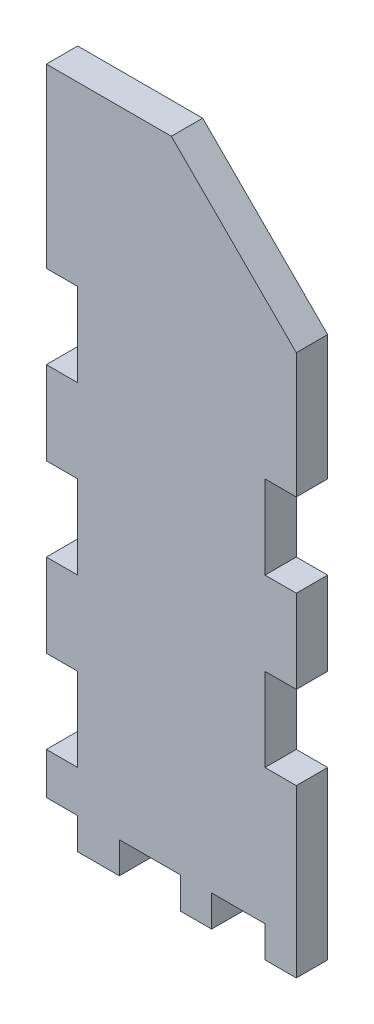
ISO-10303-21;
HEADER;
FILE_DESCRIPTION(('STEP AP214'),'2;1');
FILE_NAME('part.step','',(''),(''),'','','');
FILE_SCHEMA(('AUTOMOTIVE_DESIGN { 1 0 10303 214 1 1 1 1 }'));
ENDSEC;
DATA;
#1=APPLICATION_CONTEXT('core data for automotive mechanical design processes');
#2=APPLICATION_PROTOCOL_DEFINITION('international standard','automotive_design',2000,#1);
#3=PRODUCT_CONTEXT('',#1,'mechanical');
#4=PRODUCT('Part','Part','',(#3));
#5=PRODUCT_RELATED_PRODUCT_CATEGORY('part','',(#4));
#6=PRODUCT_DEFINITION_FORMATION('','',#4);
#7=PRODUCT_DEFINITION_CONTEXT('part definition',#1,'design');
#8=PRODUCT_DEFINITION('design','',#6,#7);
#9=PRODUCT_DEFINITION_SHAPE('','',#8);
#10=(LENGTH_UNIT() NAMED_UNIT(*) SI_UNIT(.MILLI.,.METRE.));
#11=(NAMED_UNIT(*) PLANE_ANGLE_UNIT() SI_UNIT($,.RADIAN.));
#12=(NAMED_UNIT(*) SI_UNIT($,.STERADIAN.) SOLID_ANGLE_UNIT());
#13=UNCERTAINTY_MEASURE_WITH_UNIT(LENGTH_MEASURE(1.E-05),#10,'distance_accuracy_value','');
#14=(GEOMETRIC_REPRESENTATION_CONTEXT(3) GLOBAL_UNCERTAINTY_ASSIGNED_CONTEXT((#13)) GLOBAL_UNIT_ASSIGNED_CONTEXT((#10,
#11,#12)) REPRESENTATION_CONTEXT('',''));
#15=CARTESIAN_POINT('',(0.,0.,0.));
#16=DIRECTION('',(0.,0.,1.));
#17=DIRECTION('',(1.,0.,0.));
#18=AXIS2_PLACEMENT_3D('',#15,#16,#17);
#19=CARTESIAN_POINT('',(0.,0.,4.7752));
#20=DIRECTION('',(1.,0.,0.));
#21=DIRECTION('',(0.,0.,-1.));
#22=AXIS2_PLACEMENT_3D('',#19,#20,#21);
#23=PLANE('',#22);
#24=DIRECTION('',(0.,0.,1.));
#25=VECTOR('',#24,1.);
#26=CARTESIAN_POINT('',(0.,36.5252,-1.5748));
#27=LINE('',#26,#25);
#28=CARTESIAN_POINT('',(0.,36.5252,0.));
#29=VERTEX_POINT('',#28);
#30=CARTESIAN_POINT('',(0.,36.5252,4.7752));
#31=VERTEX_POINT('',#30);
#32=EDGE_CURVE('E354',#29,#31,#27,.T.);
#33=ORIENTED_EDGE('',*,*,#32,.F.);
#34=DIRECTION('',(0.,-1.,0.));
#35=VECTOR('',#34,1.);
#36=CARTESIAN_POINT('',(0.,0.,0.));
#37=LINE('',#36,#35);
#38=CARTESIAN_POINT('',(0.,23.8252,0.));
#39=VERTEX_POINT('',#38);
#40=EDGE_CURVE('E623',#29,#39,#37,.T.);
#41=ORIENTED_EDGE('',*,*,#40,.T.);
#42=DIRECTION('',(0.,0.,1.));
#43=VECTOR('',#42,1.);
#44=CARTESIAN_POINT('',(0.,23.8252,-1.5748));
#45=LINE('',#44,#43);
#46=CARTESIAN_POINT('',(0.,23.8252,4.7752));
#47=VERTEX_POINT('',#46);
#48=EDGE_CURVE('E308',#39,#47,#45,.T.);
#49=ORIENTED_EDGE('',*,*,#48,.T.);
#50=DIRECTION('',(0.,-1.,0.));
#51=VECTOR('',#50,1.);
#52=CARTESIAN_POINT('',(0.,0.,4.7752));
#53=LINE('',#52,#51);
#54=EDGE_CURVE('E629',#31,#47,#53,.T.);
#55=ORIENTED_EDGE('',*,*,#54,.F.);
#56=EDGE_LOOP('',(#33,#41,#49,#55));
#57=FACE_BOUND('',#56,.T.);
#58=ADVANCED_FACE('F45',(#57),#23,.F.);
#59=DIRECTION('',(0.,0.,1.));
#60=VECTOR('',#59,1.);
#61=CARTESIAN_POINT('',(0.,11.1252,-1.5748));
#62=LINE('',#61,#60);
#63=CARTESIAN_POINT('',(0.,11.1252,0.));
#64=VERTEX_POINT('',#63);
#65=CARTESIAN_POINT('',(0.,11.1252,4.7752));
#66=VERTEX_POINT('',#65);
#67=EDGE_CURVE('E313',#64,#66,#62,.T.);
#68=ORIENTED_EDGE('',*,*,#67,.F.);
#69=CARTESIAN_POINT('',(0.,4.7752,0.));
#70=VERTEX_POINT('',#69);
#71=EDGE_CURVE('E419',#64,#70,#37,.T.);
#72=ORIENTED_EDGE('',*,*,#71,.T.);
#73=DIRECTION('',(0.,0.,1.));
#74=VECTOR('',#73,1.);
#75=CARTESIAN_POINT('',(0.,4.7752,-1.5748));
#76=LINE('',#75,#74);
#77=CARTESIAN_POINT('',(0.,4.7752,4.7752));
#78=VERTEX_POINT('',#77);
#79=EDGE_CURVE('E415',#70,#78,#76,.T.);
#80=ORIENTED_EDGE('',*,*,#79,.T.);
#81=EDGE_CURVE('E480',#66,#78,#53,.T.);
#82=ORIENTED_EDGE('',*,*,#81,.F.);
#83=EDGE_LOOP('',(#68,#72,#80,#82));
#84=FACE_BOUND('',#83,.T.);
#85=ADVANCED_FACE('F645',(#84),#23,.F.);
#86=DIRECTION('',(0.,0.,1.));
#87=VECTOR('',#86,1.);
#88=CARTESIAN_POINT('',(0.,74.6252,-1.5748));
#89=LINE('',#88,#87);
#90=CARTESIAN_POINT('',(0.,74.6252,0.));
#91=VERTEX_POINT('',#90);
#92=CARTESIAN_POINT('',(0.,74.6252,4.7752));
#93=VERTEX_POINT('',#92);
#94=EDGE_CURVE('E379',#91,#93,#89,.T.);
#95=ORIENTED_EDGE('',*,*,#94,.T.);
#96=CARTESIAN_POINT('',(0.,101.6,4.7752));
#97=VERTEX_POINT('',#96);
#98=EDGE_CURVE('E474',#97,#93,#53,.T.);
#99=ORIENTED_EDGE('',*,*,#98,.F.);
#100=DIRECTION('',(0.,0.,-1.));
#101=VECTOR('',#100,1.);
#102=CARTESIAN_POINT('',(0.,101.6,4.7752));
#103=LINE('',#102,#101);
#104=CARTESIAN_POINT('',(0.,101.6,0.));
#105=VERTEX_POINT('',#104);
#106=EDGE_CURVE('E495',#97,#105,#103,.T.);
#107=ORIENTED_EDGE('',*,*,#106,.T.);
#108=EDGE_CURVE('E496',#105,#91,#37,.T.);
#109=ORIENTED_EDGE('',*,*,#108,.T.);
#110=EDGE_LOOP('',(#95,#99,#107,#109));
#111=FACE_BOUND('',#110,.T.);
#112=ADVANCED_FACE('F667',(#111),#23,.F.);
#113=CARTESIAN_POINT('',(0.,0.,4.7752));
#114=DIRECTION('',(0.,0.,-1.));
#115=DIRECTION('',(-1.,0.,0.));
#116=AXIS2_PLACEMENT_3D('',#113,#114,#115);
#117=PLANE('',#116);
#118=DIRECTION('',(-1.,0.,0.));
#119=VECTOR('',#118,1.);
#120=CARTESIAN_POINT('',(38.1,50.8,4.7752));
#121=LINE('',#120,#119);
#122=CARTESIAN_POINT('',(38.1,50.8,4.7752));
#123=VERTEX_POINT('',#122);
#124=CARTESIAN_POINT('',(33.3248,50.8,4.7752));
#125=VERTEX_POINT('',#124);
#126=EDGE_CURVE('E345',#123,#125,#121,.T.);
#127=ORIENTED_EDGE('',*,*,#126,.T.);
#128=DIRECTION('',(0.,-1.,0.));
#129=VECTOR('',#128,1.);
#130=CARTESIAN_POINT('',(33.3248,63.5,4.7752));
#131=LINE('',#130,#129);
#132=CARTESIAN_POINT('',(33.3248,63.5,4.7752));
#133=VERTEX_POINT('',#132);
#134=EDGE_CURVE('E341',#133,#125,#131,.T.);
#135=ORIENTED_EDGE('',*,*,#134,.F.);
#136=DIRECTION('',(-1.,0.,0.));
#137=VECTOR('',#136,1.);
#138=CARTESIAN_POINT('',(38.1,63.5,4.7752));
#139=LINE('',#138,#137);
#140=CARTESIAN_POINT('',(38.1,63.5,4.7752));
#141=VERTEX_POINT('',#140);
#142=EDGE_CURVE('E337',#141,#133,#139,.T.);
#143=ORIENTED_EDGE('',*,*,#142,.F.);
#144=DIRECTION('',(0.,1.,0.));
#145=VECTOR('',#144,1.);
#146=CARTESIAN_POINT('',(38.1,82.55,4.7752));
#147=LINE('',#146,#145);
#148=CARTESIAN_POINT('',(38.1,82.55,4.7752));
#149=VERTEX_POINT('',#148);
#150=EDGE_CURVE('E489',#141,#149,#147,.T.);
#151=ORIENTED_EDGE('',*,*,#150,.T.);
#152=DIRECTION('',(-0.707106781186548,0.707106781186548,0.));
#153=VECTOR('',#152,1.);
#154=CARTESIAN_POINT('',(19.05,101.6,4.7752));
#155=LINE('',#154,#153);
#156=CARTESIAN_POINT('',(19.05,101.6,4.7752));
#157=VERTEX_POINT('',#156);
#158=EDGE_CURVE('E487',#149,#157,#155,.T.);
#159=ORIENTED_EDGE('',*,*,#158,.T.);
#160=DIRECTION('',(-1.,0.,0.));
#161=VECTOR('',#160,1.);
#162=CARTESIAN_POINT('',(0.,101.6,4.7752));
#163=LINE('',#162,#161);
#164=EDGE_CURVE('E492',#157,#97,#163,.T.);
#165=ORIENTED_EDGE('',*,*,#164,.T.);
#166=ORIENTED_EDGE('',*,*,#98,.T.);
#167=DIRECTION('',(1.,0.,0.));
#168=VECTOR('',#167,1.);
#169=CARTESIAN_POINT('',(0.,74.6252,4.7752));
#170=LINE('',#169,#168);
#171=CARTESIAN_POINT('',(4.7752,74.6252,4.7752));
#172=VERTEX_POINT('',#171);
#173=EDGE_CURVE('E348',#93,#172,#170,.T.);
#174=ORIENTED_EDGE('',*,*,#173,.T.);
#175=DIRECTION('',(0.,1.,0.));
#176=VECTOR('',#175,1.);
#177=CARTESIAN_POINT('',(4.7752,61.9252,4.7752));
#178=LINE('',#177,#176);
#179=CARTESIAN_POINT('',(4.7752,61.9252,4.7752));
#180=VERTEX_POINT('',#179);
#181=EDGE_CURVE('E371',#180,#172,#178,.T.);
#182=ORIENTED_EDGE('',*,*,#181,.F.);
#183=DIRECTION('',(1.,0.,0.));
#184=VECTOR('',#183,1.);
#185=CARTESIAN_POINT('',(0.,61.9252,4.7752));
#186=LINE('',#185,#184);
#187=CARTESIAN_POINT('',(0.,61.9252,4.7752));
#188=VERTEX_POINT('',#187);
#189=EDGE_CURVE('E375',#188,#180,#186,.T.);
#190=ORIENTED_EDGE('',*,*,#189,.F.);
#191=CARTESIAN_POINT('',(0.,49.2252,4.7752));
#192=VERTEX_POINT('',#191);
#193=EDGE_CURVE('E479',#188,#192,#53,.T.);
#194=ORIENTED_EDGE('',*,*,#193,.T.);
#195=DIRECTION('',(-1.,0.,0.));
#196=VECTOR('',#195,1.);
#197=CARTESIAN_POINT('',(4.7752,49.2252,4.7752));
#198=LINE('',#197,#196);
#199=CARTESIAN_POINT('',(4.7752,49.2252,4.7752));
#200=VERTEX_POINT('',#199);
#201=EDGE_CURVE('E334',#200,#192,#198,.T.);
#202=ORIENTED_EDGE('',*,*,#201,.F.);
#203=DIRECTION('',(0.,1.,0.));
#204=VECTOR('',#203,1.);
#205=CARTESIAN_POINT('',(4.7752,36.5252,4.7752));
#206=LINE('',#205,#204);
#207=CARTESIAN_POINT('',(4.7752,36.5252,4.7752));
#208=VERTEX_POINT('',#207);
#209=EDGE_CURVE('E353',#208,#200,#206,.T.);
#210=ORIENTED_EDGE('',*,*,#209,.F.);
#211=DIRECTION('',(-1.,0.,0.));
#212=VECTOR('',#211,1.);
#213=CARTESIAN_POINT('',(4.7752,36.5252,4.7752));
#214=LINE('',#213,#212);
#215=EDGE_CURVE('E362',#208,#31,#214,.T.);
#216=ORIENTED_EDGE('',*,*,#215,.T.);
#217=ORIENTED_EDGE('',*,*,#54,.T.);
#218=DIRECTION('',(-1.,0.,0.));
#219=VECTOR('',#218,1.);
#220=CARTESIAN_POINT('',(4.7752,23.8252,4.7752));
#221=LINE('',#220,#219);
#222=CARTESIAN_POINT('',(4.7752,23.8252,4.7752));
#223=VERTEX_POINT('',#222);
#224=EDGE_CURVE('E283',#223,#47,#221,.T.);
#225=ORIENTED_EDGE('',*,*,#224,.F.);
#226=DIRECTION('',(0.,1.,0.));
#227=VECTOR('',#226,1.);
#228=CARTESIAN_POINT('',(4.7752,11.1252,4.7752));
#229=LINE('',#228,#227);
#230=CARTESIAN_POINT('',(4.7752,11.1252,4.7752));
#231=VERTEX_POINT('',#230);
#232=EDGE_CURVE('E312',#231,#223,#229,.T.);
#233=ORIENTED_EDGE('',*,*,#232,.F.);
#234=DIRECTION('',(-1.,0.,0.));
#235=VECTOR('',#234,1.);
#236=CARTESIAN_POINT('',(4.7752,11.1252,4.7752));
#237=LINE('',#236,#235);
#238=EDGE_CURVE('E324',#231,#66,#237,.T.);
#239=ORIENTED_EDGE('',*,*,#238,.T.);
#240=ORIENTED_EDGE('',*,*,#81,.T.);
#241=DIRECTION('',(1.,0.,0.));
#242=VECTOR('',#241,1.);
#243=CARTESIAN_POINT('',(0.,4.7752,4.7752));
#244=LINE('',#243,#242);
#245=CARTESIAN_POINT('',(4.7752,4.7752,4.7752));
#246=VERTEX_POINT('',#245);
#247=EDGE_CURVE('E406',#78,#246,#244,.T.);
#248=ORIENTED_EDGE('',*,*,#247,.T.);
#249=DIRECTION('',(0.,1.,0.));
#250=VECTOR('',#249,1.);
#251=CARTESIAN_POINT('',(4.7752,0.,4.7752));
#252=LINE('',#251,#250);
#253=CARTESIAN_POINT('',(4.7752,0.,4.7752));
#254=VERTEX_POINT('',#253);
#255=EDGE_CURVE('E410',#254,#246,#252,.T.);
#256=ORIENTED_EDGE('',*,*,#255,.F.);
#257=DIRECTION('',(1.,0.,0.));
#258=VECTOR('',#257,1.);
#259=CARTESIAN_POINT('',(0.,0.,4.7752));
#260=LINE('',#259,#258);
#261=CARTESIAN_POINT('',(11.1252,0.,4.7752));
#262=VERTEX_POINT('',#261);
#263=EDGE_CURVE('E484',#254,#262,#260,.T.);
#264=ORIENTED_EDGE('',*,*,#263,.T.);
#265=DIRECTION('',(0.,1.,0.));
#266=VECTOR('',#265,1.);
#267=CARTESIAN_POINT('',(11.1252,0.,4.7752));
#268=LINE('',#267,#266);
#269=CARTESIAN_POINT('',(11.1252,4.7752,4.7752));
#270=VERTEX_POINT('',#269);
#271=EDGE_CURVE('E430',#262,#270,#268,.T.);
#272=ORIENTED_EDGE('',*,*,#271,.T.);
#273=DIRECTION('',(1.,0.,0.));
#274=VECTOR('',#273,1.);
#275=CARTESIAN_POINT('',(0.,4.7752,4.7752));
#276=LINE('',#275,#274);
#277=CARTESIAN_POINT('',(20.4173636116443,4.7752,4.7752));
#278=VERTEX_POINT('',#277);
#279=EDGE_CURVE('E426',#270,#278,#276,.T.);
#280=ORIENTED_EDGE('',*,*,#279,.T.);
#281=DIRECTION('',(0.,1.,0.));
#282=VECTOR('',#281,1.);
#283=CARTESIAN_POINT('',(20.4173636116443,0.,4.7752));
#284=LINE('',#283,#282);
#285=CARTESIAN_POINT('',(20.4173636116443,0.,4.7752));
#286=VERTEX_POINT('',#285);
#287=EDGE_CURVE('E435',#286,#278,#284,.T.);
#288=ORIENTED_EDGE('',*,*,#287,.F.);
#289=CARTESIAN_POINT('',(25.1925636116443,0.,4.7752));
#290=VERTEX_POINT('',#289);
#291=EDGE_CURVE('E483',#286,#290,#260,.T.);
#292=ORIENTED_EDGE('',*,*,#291,.T.);
#293=DIRECTION('',(0.,1.,0.));
#294=VECTOR('',#293,1.);
#295=CARTESIAN_POINT('',(25.1925636116443,0.,4.7752));
#296=LINE('',#295,#294);
#297=CARTESIAN_POINT('',(25.1925636116443,4.7752,4.7752));
#298=VERTEX_POINT('',#297);
#299=EDGE_CURVE('E454',#290,#298,#296,.T.);
#300=ORIENTED_EDGE('',*,*,#299,.T.);
#301=DIRECTION('',(1.,0.,0.));
#302=VECTOR('',#301,1.);
#303=CARTESIAN_POINT('',(0.,4.7752,4.7752));
#304=LINE('',#303,#302);
#305=CARTESIAN_POINT('',(33.3248,4.7752,4.7752));
#306=VERTEX_POINT('',#305);
#307=EDGE_CURVE('E405',#298,#306,#304,.T.);
#308=ORIENTED_EDGE('',*,*,#307,.T.);
#309=DIRECTION('',(0.,1.,0.));
#310=VECTOR('',#309,1.);
#311=CARTESIAN_POINT('',(33.3248,0.,4.7752));
#312=LINE('',#311,#310);
#313=CARTESIAN_POINT('',(33.3248,0.,4.7752));
#314=VERTEX_POINT('',#313);
#315=EDGE_CURVE('E458',#314,#306,#312,.T.);
#316=ORIENTED_EDGE('',*,*,#315,.F.);
#317=CARTESIAN_POINT('',(38.1,0.,4.7752));
#318=VERTEX_POINT('',#317);
#319=EDGE_CURVE('E478',#314,#318,#260,.T.);
#320=ORIENTED_EDGE('',*,*,#319,.T.);
#321=CARTESIAN_POINT('',(38.1,25.4,4.7752));
#322=VERTEX_POINT('',#321);
#323=EDGE_CURVE('E299',#318,#322,#147,.T.);
#324=ORIENTED_EDGE('',*,*,#323,.T.);
#325=DIRECTION('',(1.,0.,0.));
#326=VECTOR('',#325,1.);
#327=CARTESIAN_POINT('',(33.3248,25.4,4.7752));
#328=LINE('',#327,#326);
#329=CARTESIAN_POINT('',(33.3248,25.4,4.7752));
#330=VERTEX_POINT('',#329);
#331=EDGE_CURVE('E275',#330,#322,#328,.T.);
#332=ORIENTED_EDGE('',*,*,#331,.F.);
#333=DIRECTION('',(0.,-1.,0.));
#334=VECTOR('',#333,1.);
#335=CARTESIAN_POINT('',(33.3248,38.1,4.7752));
#336=LINE('',#335,#334);
#337=CARTESIAN_POINT('',(33.3248,38.1,4.7752));
#338=VERTEX_POINT('',#337);
#339=EDGE_CURVE('E286',#338,#330,#336,.T.);
#340=ORIENTED_EDGE('',*,*,#339,.F.);
#341=DIRECTION('',(1.,0.,0.));
#342=VECTOR('',#341,1.);
#343=CARTESIAN_POINT('',(33.3248,38.1,4.7752));
#344=LINE('',#343,#342);
#345=CARTESIAN_POINT('',(38.1,38.1,4.7752));
#346=VERTEX_POINT('',#345);
#347=EDGE_CURVE('E293',#338,#346,#344,.T.);
#348=ORIENTED_EDGE('',*,*,#347,.T.);
#349=EDGE_CURVE('E488',#346,#123,#147,.T.);
#350=ORIENTED_EDGE('',*,*,#349,.T.);
#351=EDGE_LOOP('',(#127,#135,#143,#151,#159,#165,#166,#174,#182,#190,#194,#202,#210,#216,#217,
#225,#233,#239,#240,#248,#256,#264,#272,#280,#288,#292,#300,#308,#316,#320,#324,#332,#340,#348,#350));
#352=FACE_BOUND('',#351,.T.);
#353=ADVANCED_FACE('F297',(#352),#117,.F.);
#354=CARTESIAN_POINT('',(0.,0.,0.));
#355=DIRECTION('',(0.,0.,-1.));
#356=DIRECTION('',(-1.,0.,0.));
#357=AXIS2_PLACEMENT_3D('',#354,#355,#356);
#358=PLANE('',#357);
#359=DIRECTION('',(0.,1.,0.));
#360=VECTOR('',#359,1.);
#361=CARTESIAN_POINT('',(33.3248,0.,0.));
#362=LINE('',#361,#360);
#363=CARTESIAN_POINT('',(33.3248,50.8,0.));
#364=VERTEX_POINT('',#363);
#365=CARTESIAN_POINT('',(33.3248,63.5,0.));
#366=VERTEX_POINT('',#365);
#367=EDGE_CURVE('E11',#364,#366,#362,.T.);
#368=ORIENTED_EDGE('',*,*,#367,.F.);
#369=DIRECTION('',(1.,0.,0.));
#370=VECTOR('',#369,1.);
#371=CARTESIAN_POINT('',(0.,50.8,0.));
#372=LINE('',#371,#370);
#373=CARTESIAN_POINT('',(38.1,50.8,0.));
#374=VERTEX_POINT('',#373);
#375=EDGE_CURVE('E401',#364,#374,#372,.T.);
#376=ORIENTED_EDGE('',*,*,#375,.T.);
#377=DIRECTION('',(0.,1.,0.));
#378=VECTOR('',#377,1.);
#379=CARTESIAN_POINT('',(38.1,82.55,0.));
#380=LINE('',#379,#378);
#381=CARTESIAN_POINT('',(38.1,38.1,0.));
#382=VERTEX_POINT('',#381);
#383=EDGE_CURVE('E511',#382,#374,#380,.T.);
#384=ORIENTED_EDGE('',*,*,#383,.F.);
#385=DIRECTION('',(-1.,0.,0.));
#386=VECTOR('',#385,1.);
#387=CARTESIAN_POINT('',(0.,38.1,0.));
#388=LINE('',#387,#386);
#389=CARTESIAN_POINT('',(33.3248,38.1,0.));
#390=VERTEX_POINT('',#389);
#391=EDGE_CURVE('E392',#382,#390,#388,.T.);
#392=ORIENTED_EDGE('',*,*,#391,.T.);
#393=DIRECTION('',(0.,1.,0.));
#394=VECTOR('',#393,1.);
#395=CARTESIAN_POINT('',(33.3248,0.,0.));
#396=LINE('',#395,#394);
#397=CARTESIAN_POINT('',(33.3248,25.4,0.));
#398=VERTEX_POINT('',#397);
#399=EDGE_CURVE('E596',#398,#390,#396,.T.);
#400=ORIENTED_EDGE('',*,*,#399,.F.);
#401=DIRECTION('',(-1.,0.,0.));
#402=VECTOR('',#401,1.);
#403=CARTESIAN_POINT('',(0.,25.4,0.));
#404=LINE('',#403,#402);
#405=CARTESIAN_POINT('',(38.1,25.4,0.));
#406=VERTEX_POINT('',#405);
#407=EDGE_CURVE('E278',#406,#398,#404,.T.);
#408=ORIENTED_EDGE('',*,*,#407,.F.);
#409=CARTESIAN_POINT('',(38.1,0.,0.));
#410=VERTEX_POINT('',#409);
#411=EDGE_CURVE('E506',#410,#406,#380,.T.);
#412=ORIENTED_EDGE('',*,*,#411,.F.);
#413=DIRECTION('',(1.,0.,0.));
#414=VECTOR('',#413,1.);
#415=CARTESIAN_POINT('',(0.,0.,0.));
#416=LINE('',#415,#414);
#417=CARTESIAN_POINT('',(33.3248,0.,0.));
#418=VERTEX_POINT('',#417);
#419=EDGE_CURVE('E500',#418,#410,#416,.T.);
#420=ORIENTED_EDGE('',*,*,#419,.F.);
#421=DIRECTION('',(0.,-1.,0.));
#422=VECTOR('',#421,1.);
#423=CARTESIAN_POINT('',(33.3248,0.,0.));
#424=LINE('',#423,#422);
#425=CARTESIAN_POINT('',(33.3248,4.7752,0.));
#426=VERTEX_POINT('',#425);
#427=EDGE_CURVE('E541',#426,#418,#424,.T.);
#428=ORIENTED_EDGE('',*,*,#427,.F.);
#429=DIRECTION('',(-1.,0.,0.));
#430=VECTOR('',#429,1.);
#431=CARTESIAN_POINT('',(0.,4.7752,0.));
#432=LINE('',#431,#430);
#433=CARTESIAN_POINT('',(25.1925636116443,4.7752,0.));
#434=VERTEX_POINT('',#433);
#435=EDGE_CURVE('E537',#426,#434,#432,.T.);
#436=ORIENTED_EDGE('',*,*,#435,.T.);
#437=DIRECTION('',(0.,-1.,0.));
#438=VECTOR('',#437,1.);
#439=CARTESIAN_POINT('',(25.1925636116443,0.,0.));
#440=LINE('',#439,#438);
#441=CARTESIAN_POINT('',(25.1925636116443,0.,0.));
#442=VERTEX_POINT('',#441);
#443=EDGE_CURVE('E533',#434,#442,#440,.T.);
#444=ORIENTED_EDGE('',*,*,#443,.T.);
#445=CARTESIAN_POINT('',(20.4173636116443,0.,0.));
#446=VERTEX_POINT('',#445);
#447=EDGE_CURVE('E504',#446,#442,#416,.T.);
#448=ORIENTED_EDGE('',*,*,#447,.F.);
#449=DIRECTION('',(0.,-1.,0.));
#450=VECTOR('',#449,1.);
#451=CARTESIAN_POINT('',(20.4173636116443,0.,0.));
#452=LINE('',#451,#450);
#453=CARTESIAN_POINT('',(20.4173636116443,4.7752,0.));
#454=VERTEX_POINT('',#453);
#455=EDGE_CURVE('E552',#454,#446,#452,.T.);
#456=ORIENTED_EDGE('',*,*,#455,.F.);
#457=DIRECTION('',(-1.,0.,0.));
#458=VECTOR('',#457,1.);
#459=CARTESIAN_POINT('',(0.,4.7752,0.));
#460=LINE('',#459,#458);
#461=CARTESIAN_POINT('',(11.1252,4.7752,0.));
#462=VERTEX_POINT('',#461);
#463=EDGE_CURVE('E548',#454,#462,#460,.T.);
#464=ORIENTED_EDGE('',*,*,#463,.T.);
#465=DIRECTION('',(0.,-1.,0.));
#466=VECTOR('',#465,1.);
#467=CARTESIAN_POINT('',(11.1252,0.,0.));
#468=LINE('',#467,#466);
#469=CARTESIAN_POINT('',(11.1252,0.,0.));
#470=VERTEX_POINT('',#469);
#471=EDGE_CURVE('E544',#462,#470,#468,.T.);
#472=ORIENTED_EDGE('',*,*,#471,.T.);
#473=CARTESIAN_POINT('',(4.7752,0.,0.));
#474=VERTEX_POINT('',#473);
#475=EDGE_CURVE('E505',#474,#470,#416,.T.);
#476=ORIENTED_EDGE('',*,*,#475,.F.);
#477=DIRECTION('',(0.,-1.,0.));
#478=VECTOR('',#477,1.);
#479=CARTESIAN_POINT('',(4.7752,0.,0.));
#480=LINE('',#479,#478);
#481=CARTESIAN_POINT('',(4.7752,4.7752,0.));
#482=VERTEX_POINT('',#481);
#483=EDGE_CURVE('E555',#482,#474,#480,.T.);
#484=ORIENTED_EDGE('',*,*,#483,.F.);
#485=DIRECTION('',(-1.,0.,0.));
#486=VECTOR('',#485,1.);
#487=CARTESIAN_POINT('',(0.,4.7752,0.));
#488=LINE('',#487,#486);
#489=EDGE_CURVE('E558',#482,#70,#488,.T.);
#490=ORIENTED_EDGE('',*,*,#489,.T.);
#491=ORIENTED_EDGE('',*,*,#71,.F.);
#492=DIRECTION('',(1.,0.,0.));
#493=VECTOR('',#492,1.);
#494=CARTESIAN_POINT('',(0.,11.1252,0.));
#495=LINE('',#494,#493);
#496=CARTESIAN_POINT('',(4.7752,11.1252,0.));
#497=VERTEX_POINT('',#496);
#498=EDGE_CURVE('E586',#64,#497,#495,.T.);
#499=ORIENTED_EDGE('',*,*,#498,.T.);
#500=DIRECTION('',(0.,-1.,0.));
#501=VECTOR('',#500,1.);
#502=CARTESIAN_POINT('',(4.7752,0.,0.));
#503=LINE('',#502,#501);
#504=CARTESIAN_POINT('',(4.7752,23.8252,0.));
#505=VERTEX_POINT('',#504);
#506=EDGE_CURVE('E590',#505,#497,#503,.T.);
#507=ORIENTED_EDGE('',*,*,#506,.F.);
#508=DIRECTION('',(1.,0.,0.));
#509=VECTOR('',#508,1.);
#510=CARTESIAN_POINT('',(0.,23.8252,0.));
#511=LINE('',#510,#509);
#512=EDGE_CURVE('E593',#39,#505,#511,.T.);
#513=ORIENTED_EDGE('',*,*,#512,.F.);
#514=ORIENTED_EDGE('',*,*,#40,.F.);
#515=DIRECTION('',(1.,0.,0.));
#516=VECTOR('',#515,1.);
#517=CARTESIAN_POINT('',(0.,36.5252,0.));
#518=LINE('',#517,#516);
#519=CARTESIAN_POINT('',(4.7752,36.5252,0.));
#520=VERTEX_POINT('',#519);
#521=EDGE_CURVE('E599',#29,#520,#518,.T.);
#522=ORIENTED_EDGE('',*,*,#521,.T.);
#523=DIRECTION('',(0.,-1.,0.));
#524=VECTOR('',#523,1.);
#525=CARTESIAN_POINT('',(4.7752,0.,0.));
#526=LINE('',#525,#524);
#527=CARTESIAN_POINT('',(4.7752,49.2252,0.));
#528=VERTEX_POINT('',#527);
#529=EDGE_CURVE('E603',#528,#520,#526,.T.);
#530=ORIENTED_EDGE('',*,*,#529,.F.);
#531=DIRECTION('',(1.,0.,0.));
#532=VECTOR('',#531,1.);
#533=CARTESIAN_POINT('',(0.,49.2252,0.));
#534=LINE('',#533,#532);
#535=CARTESIAN_POINT('',(0.,49.2252,0.));
#536=VERTEX_POINT('',#535);
#537=EDGE_CURVE('E54',#536,#528,#534,.T.);
#538=ORIENTED_EDGE('',*,*,#537,.F.);
#539=CARTESIAN_POINT('',(0.,61.9252,0.));
#540=VERTEX_POINT('',#539);
#541=EDGE_CURVE('E501',#540,#536,#37,.T.);
#542=ORIENTED_EDGE('',*,*,#541,.F.);
#543=DIRECTION('',(-1.,0.,0.));
#544=VECTOR('',#543,1.);
#545=CARTESIAN_POINT('',(0.,61.9252,0.));
#546=LINE('',#545,#544);
#547=CARTESIAN_POINT('',(4.7752,61.9252,0.));
#548=VERTEX_POINT('',#547);
#549=EDGE_CURVE('E575',#548,#540,#546,.T.);
#550=ORIENTED_EDGE('',*,*,#549,.F.);
#551=DIRECTION('',(0.,-1.,0.));
#552=VECTOR('',#551,1.);
#553=CARTESIAN_POINT('',(4.7752,0.,0.));
#554=LINE('',#553,#552);
#555=CARTESIAN_POINT('',(4.7752,74.6252,0.));
#556=VERTEX_POINT('',#555);
#557=EDGE_CURVE('E578',#556,#548,#554,.T.);
#558=ORIENTED_EDGE('',*,*,#557,.F.);
#559=DIRECTION('',(-1.,0.,0.));
#560=VECTOR('',#559,1.);
#561=CARTESIAN_POINT('',(0.,74.6252,0.));
#562=LINE('',#561,#560);
#563=EDGE_CURVE('E582',#556,#91,#562,.T.);
#564=ORIENTED_EDGE('',*,*,#563,.T.);
#565=ORIENTED_EDGE('',*,*,#108,.F.);
#566=DIRECTION('',(-1.,0.,0.));
#567=VECTOR('',#566,1.);
#568=CARTESIAN_POINT('',(0.,101.6,0.));
#569=LINE('',#568,#567);
#570=CARTESIAN_POINT('',(19.05,101.6,0.));
#571=VERTEX_POINT('',#570);
#572=EDGE_CURVE('E515',#571,#105,#569,.T.);
#573=ORIENTED_EDGE('',*,*,#572,.F.);
#574=DIRECTION('',(-0.707106781186548,0.707106781186548,0.));
#575=VECTOR('',#574,1.);
#576=CARTESIAN_POINT('',(19.05,101.6,0.));
#577=LINE('',#576,#575);
#578=CARTESIAN_POINT('',(38.1,82.55,0.));
#579=VERTEX_POINT('',#578);
#580=EDGE_CURVE('E510',#579,#571,#577,.T.);
#581=ORIENTED_EDGE('',*,*,#580,.F.);
#582=CARTESIAN_POINT('',(38.1,63.5,0.));
#583=VERTEX_POINT('',#582);
#584=EDGE_CURVE('E512',#583,#579,#380,.T.);
#585=ORIENTED_EDGE('',*,*,#584,.F.);
#586=DIRECTION('',(1.,0.,0.));
#587=VECTOR('',#586,1.);
#588=CARTESIAN_POINT('',(0.,63.5,0.));
#589=LINE('',#588,#587);
#590=EDGE_CURVE('E398',#366,#583,#589,.T.);
#591=ORIENTED_EDGE('',*,*,#590,.F.);
#592=EDGE_LOOP('',(#368,#376,#384,#392,#400,#408,#412,#420,#428,#436,#444,#448,#456,#464,#472,
#476,#484,#490,#491,#499,#507,#513,#514,#522,#530,#538,#542,#550,#558,#564,#565,#573,#581,#585,#591));
#593=FACE_BOUND('',#592,.T.);
#594=ADVANCED_FACE('F619',(#593),#358,.T.);
#595=CARTESIAN_POINT('',(38.1,82.55,4.7752));
#596=DIRECTION('',(-1.,0.,0.));
#597=DIRECTION('',(0.,-1.,0.));
#598=AXIS2_PLACEMENT_3D('',#595,#596,#597);
#599=PLANE('',#598);
#600=DIRECTION('',(0.,0.,-1.));
#601=VECTOR('',#600,1.);
#602=CARTESIAN_POINT('',(38.1,50.8,4.7752));
#603=LINE('',#602,#601);
#604=EDGE_CURVE('E572',#123,#374,#603,.T.);
#605=ORIENTED_EDGE('',*,*,#604,.F.);
#606=ORIENTED_EDGE('',*,*,#349,.F.);
#607=DIRECTION('',(0.,0.,1.));
#608=VECTOR('',#607,1.);
#609=CARTESIAN_POINT('',(38.1,38.1,4.7752));
#610=LINE('',#609,#608);
#611=EDGE_CURVE('E562',#382,#346,#610,.T.);
#612=ORIENTED_EDGE('',*,*,#611,.F.);
#613=ORIENTED_EDGE('',*,*,#383,.T.);
#614=EDGE_LOOP('',(#605,#606,#612,#613));
#615=FACE_BOUND('',#614,.T.);
#616=ADVANCED_FACE('F724',(#615),#599,.F.);
#617=ORIENTED_EDGE('',*,*,#150,.F.);
#618=DIRECTION('',(0.,0.,-1.));
#619=VECTOR('',#618,1.);
#620=CARTESIAN_POINT('',(38.1,63.5,4.7752));
#621=LINE('',#620,#619);
#622=EDGE_CURVE('E568',#141,#583,#621,.T.);
#623=ORIENTED_EDGE('',*,*,#622,.T.);
#624=ORIENTED_EDGE('',*,*,#584,.T.);
#625=DIRECTION('',(0.,0.,-1.));
#626=VECTOR('',#625,1.);
#627=CARTESIAN_POINT('',(38.1,82.55,4.7752));
#628=LINE('',#627,#626);
#629=EDGE_CURVE('E525',#149,#579,#628,.T.);
#630=ORIENTED_EDGE('',*,*,#629,.F.);
#631=EDGE_LOOP('',(#617,#623,#624,#630));
#632=FACE_BOUND('',#631,.T.);
#633=ADVANCED_FACE('F683',(#632),#599,.F.);
#634=ORIENTED_EDGE('',*,*,#541,.T.);
#635=DIRECTION('',(0.,0.,1.));
#636=VECTOR('',#635,1.);
#637=CARTESIAN_POINT('',(0.,49.2252,-1.5748));
#638=LINE('',#637,#636);
#639=EDGE_CURVE('E349',#536,#192,#638,.T.);
#640=ORIENTED_EDGE('',*,*,#639,.T.);
#641=ORIENTED_EDGE('',*,*,#193,.F.);
#642=DIRECTION('',(0.,0.,1.));
#643=VECTOR('',#642,1.);
#644=CARTESIAN_POINT('',(0.,61.9252,-1.5748));
#645=LINE('',#644,#643);
#646=EDGE_CURVE('E383',#540,#188,#645,.T.);
#647=ORIENTED_EDGE('',*,*,#646,.F.);
#648=EDGE_LOOP('',(#634,#640,#641,#647));
#649=FACE_BOUND('',#648,.T.);
#650=ADVANCED_FACE('F47',(#649),#23,.F.);
#651=CARTESIAN_POINT('',(0.,0.,4.7752));
#652=DIRECTION('',(0.,1.,0.));
#653=DIRECTION('',(0.,0.,1.));
#654=AXIS2_PLACEMENT_3D('',#651,#652,#653);
#655=PLANE('',#654);
#656=ORIENTED_EDGE('',*,*,#263,.F.);
#657=DIRECTION('',(0.,0.,1.));
#658=VECTOR('',#657,1.);
#659=CARTESIAN_POINT('',(4.7752,0.,-1.5748));
#660=LINE('',#659,#658);
#661=EDGE_CURVE('E420',#474,#254,#660,.T.);
#662=ORIENTED_EDGE('',*,*,#661,.F.);
#663=ORIENTED_EDGE('',*,*,#475,.T.);
#664=DIRECTION('',(0.,0.,1.));
#665=VECTOR('',#664,1.);
#666=CARTESIAN_POINT('',(11.1252,0.,-1.5748));
#667=LINE('',#666,#665);
#668=EDGE_CURVE('E445',#470,#262,#667,.T.);
#669=ORIENTED_EDGE('',*,*,#668,.T.);
#670=EDGE_LOOP('',(#656,#662,#663,#669));
#671=FACE_BOUND('',#670,.T.);
#672=ADVANCED_FACE('F749',(#671),#655,.F.);
#673=ORIENTED_EDGE('',*,*,#291,.F.);
#674=DIRECTION('',(0.,0.,1.));
#675=VECTOR('',#674,1.);
#676=CARTESIAN_POINT('',(20.4173636116443,0.,-1.5748));
#677=LINE('',#676,#675);
#678=EDGE_CURVE('E442',#446,#286,#677,.T.);
#679=ORIENTED_EDGE('',*,*,#678,.F.);
#680=ORIENTED_EDGE('',*,*,#447,.T.);
#681=DIRECTION('',(0.,0.,1.));
#682=VECTOR('',#681,1.);
#683=CARTESIAN_POINT('',(25.1925636116443,0.,-1.5748));
#684=LINE('',#683,#682);
#685=EDGE_CURVE('E468',#442,#290,#684,.T.);
#686=ORIENTED_EDGE('',*,*,#685,.T.);
#687=EDGE_LOOP('',(#673,#679,#680,#686));
#688=FACE_BOUND('',#687,.T.);
#689=ADVANCED_FACE('F698',(#688),#655,.F.);
#690=ORIENTED_EDGE('',*,*,#319,.F.);
#691=DIRECTION('',(0.,0.,1.));
#692=VECTOR('',#691,1.);
#693=CARTESIAN_POINT('',(33.3248,0.,-1.5748));
#694=LINE('',#693,#692);
#695=EDGE_CURVE('E465',#418,#314,#694,.T.);
#696=ORIENTED_EDGE('',*,*,#695,.F.);
#697=ORIENTED_EDGE('',*,*,#419,.T.);
#698=DIRECTION('',(0.,0.,-1.));
#699=VECTOR('',#698,1.);
#700=CARTESIAN_POINT('',(38.1,0.,4.7752));
#701=LINE('',#700,#699);
#702=EDGE_CURVE('E529',#318,#410,#701,.T.);
#703=ORIENTED_EDGE('',*,*,#702,.F.);
#704=EDGE_LOOP('',(#690,#696,#697,#703));
#705=FACE_BOUND('',#704,.T.);
#706=ADVANCED_FACE('F755',(#705),#655,.F.);
#707=ORIENTED_EDGE('',*,*,#411,.T.);
#708=DIRECTION('',(0.,0.,1.));
#709=VECTOR('',#708,1.);
#710=CARTESIAN_POINT('',(38.1,25.4,4.7752));
#711=LINE('',#710,#709);
#712=EDGE_CURVE('E565',#406,#322,#711,.T.);
#713=ORIENTED_EDGE('',*,*,#712,.T.);
#714=ORIENTED_EDGE('',*,*,#323,.F.);
#715=ORIENTED_EDGE('',*,*,#702,.T.);
#716=EDGE_LOOP('',(#707,#713,#714,#715));
#717=FACE_BOUND('',#716,.T.);
#718=ADVANCED_FACE('F757',(#717),#599,.F.);
#719=CARTESIAN_POINT('',(19.05,101.6,4.7752));
#720=DIRECTION('',(-0.707106781186548,-0.707106781186547,0.));
#721=DIRECTION('',(0.707106781186547,-0.707106781186548,0.));
#722=AXIS2_PLACEMENT_3D('',#719,#720,#721);
#723=PLANE('',#722);
#724=ORIENTED_EDGE('',*,*,#580,.T.);
#725=DIRECTION('',(0.,0.,-1.));
#726=VECTOR('',#725,1.);
#727=CARTESIAN_POINT('',(19.05,101.6,4.7752));
#728=LINE('',#727,#726);
#729=EDGE_CURVE('E521',#157,#571,#728,.T.);
#730=ORIENTED_EDGE('',*,*,#729,.F.);
#731=ORIENTED_EDGE('',*,*,#158,.F.);
#732=ORIENTED_EDGE('',*,*,#629,.T.);
#733=EDGE_LOOP('',(#724,#730,#731,#732));
#734=FACE_BOUND('',#733,.T.);
#735=ADVANCED_FACE('F678',(#734),#723,.F.);
#736=CARTESIAN_POINT('',(0.,101.6,4.7752));
#737=DIRECTION('',(0.,-1.,0.));
#738=DIRECTION('',(0.,0.,-1.));
#739=AXIS2_PLACEMENT_3D('',#736,#737,#738);
#740=PLANE('',#739);
#741=ORIENTED_EDGE('',*,*,#572,.T.);
#742=ORIENTED_EDGE('',*,*,#106,.F.);
#743=ORIENTED_EDGE('',*,*,#164,.F.);
#744=ORIENTED_EDGE('',*,*,#729,.T.);
#745=EDGE_LOOP('',(#741,#742,#743,#744));
#746=FACE_BOUND('',#745,.T.);
#747=ADVANCED_FACE('F672',(#746),#740,.F.);
#748=CARTESIAN_POINT('',(0.,4.7752,-1.5748));
#749=DIRECTION('',(0.,-1.,0.));
#750=DIRECTION('',(1.,0.,0.));
#751=AXIS2_PLACEMENT_3D('',#748,#749,#750);
#752=PLANE('',#751);
#753=DIRECTION('',(0.,0.,1.));
#754=VECTOR('',#753,1.);
#755=CARTESIAN_POINT('',(33.3248,4.7752,-1.5748));
#756=LINE('',#755,#754);
#757=EDGE_CURVE('E431',#426,#306,#756,.T.);
#758=ORIENTED_EDGE('',*,*,#757,.T.);
#759=ORIENTED_EDGE('',*,*,#307,.F.);
#760=DIRECTION('',(0.,0.,1.));
#761=VECTOR('',#760,1.);
#762=CARTESIAN_POINT('',(25.1925636116443,4.7752,-1.5748));
#763=LINE('',#762,#761);
#764=EDGE_CURVE('E462',#434,#298,#763,.T.);
#765=ORIENTED_EDGE('',*,*,#764,.F.);
#766=ORIENTED_EDGE('',*,*,#435,.F.);
#767=EDGE_LOOP('',(#758,#759,#765,#766));
#768=FACE_BOUND('',#767,.T.);
#769=ADVANCED_FACE('F707',(#768),#752,.T.);
#770=CARTESIAN_POINT('',(33.3248,0.,-1.5748));
#771=DIRECTION('',(1.,0.,0.));
#772=DIRECTION('',(0.,0.,-1.));
#773=AXIS2_PLACEMENT_3D('',#770,#771,#772);
#774=PLANE('',#773);
#775=ORIENTED_EDGE('',*,*,#427,.T.);
#776=ORIENTED_EDGE('',*,*,#695,.T.);
#777=ORIENTED_EDGE('',*,*,#315,.T.);
#778=ORIENTED_EDGE('',*,*,#757,.F.);
#779=EDGE_LOOP('',(#775,#776,#777,#778));
#780=FACE_BOUND('',#779,.T.);
#781=ADVANCED_FACE('F785',(#780),#774,.F.);
#782=CARTESIAN_POINT('',(25.1925636116443,0.,-1.5748));
#783=DIRECTION('',(1.,0.,0.));
#784=DIRECTION('',(0.,0.,-1.));
#785=AXIS2_PLACEMENT_3D('',#782,#783,#784);
#786=PLANE('',#785);
#787=ORIENTED_EDGE('',*,*,#764,.T.);
#788=ORIENTED_EDGE('',*,*,#299,.F.);
#789=ORIENTED_EDGE('',*,*,#685,.F.);
#790=ORIENTED_EDGE('',*,*,#443,.F.);
#791=EDGE_LOOP('',(#787,#788,#789,#790));
#792=FACE_BOUND('',#791,.T.);
#793=ADVANCED_FACE('F704',(#792),#786,.T.);
#794=CARTESIAN_POINT('',(0.,4.7752,-1.5748));
#795=DIRECTION('',(0.,-1.,0.));
#796=DIRECTION('',(0.,0.,-1.));
#797=AXIS2_PLACEMENT_3D('',#794,#795,#796);
#798=PLANE('',#797);
#799=DIRECTION('',(0.,0.,1.));
#800=VECTOR('',#799,1.);
#801=CARTESIAN_POINT('',(20.4173636116443,4.7752,-1.5748));
#802=LINE('',#801,#800);
#803=EDGE_CURVE('E411',#454,#278,#802,.T.);
#804=ORIENTED_EDGE('',*,*,#803,.T.);
#805=ORIENTED_EDGE('',*,*,#279,.F.);
#806=DIRECTION('',(0.,0.,1.));
#807=VECTOR('',#806,1.);
#808=CARTESIAN_POINT('',(11.1252,4.7752,-1.5748));
#809=LINE('',#808,#807);
#810=EDGE_CURVE('E439',#462,#270,#809,.T.);
#811=ORIENTED_EDGE('',*,*,#810,.F.);
#812=ORIENTED_EDGE('',*,*,#463,.F.);
#813=EDGE_LOOP('',(#804,#805,#811,#812));
#814=FACE_BOUND('',#813,.T.);
#815=ADVANCED_FACE('F971',(#814),#798,.T.);
#816=CARTESIAN_POINT('',(20.4173636116443,0.,-1.5748));
#817=DIRECTION('',(1.,0.,0.));
#818=DIRECTION('',(0.,0.,-1.));
#819=AXIS2_PLACEMENT_3D('',#816,#817,#818);
#820=PLANE('',#819);
#821=ORIENTED_EDGE('',*,*,#455,.T.);
#822=ORIENTED_EDGE('',*,*,#678,.T.);
#823=ORIENTED_EDGE('',*,*,#287,.T.);
#824=ORIENTED_EDGE('',*,*,#803,.F.);
#825=EDGE_LOOP('',(#821,#822,#823,#824));
#826=FACE_BOUND('',#825,.T.);
#827=ADVANCED_FACE('F961',(#826),#820,.F.);
#828=CARTESIAN_POINT('',(11.1252,0.,-1.5748));
#829=DIRECTION('',(1.,0.,0.));
#830=DIRECTION('',(0.,0.,-1.));
#831=AXIS2_PLACEMENT_3D('',#828,#829,#830);
#832=PLANE('',#831);
#833=ORIENTED_EDGE('',*,*,#810,.T.);
#834=ORIENTED_EDGE('',*,*,#271,.F.);
#835=ORIENTED_EDGE('',*,*,#668,.F.);
#836=ORIENTED_EDGE('',*,*,#471,.F.);
#837=EDGE_LOOP('',(#833,#834,#835,#836));
#838=FACE_BOUND('',#837,.T.);
#839=ADVANCED_FACE('F952',(#838),#832,.T.);
#840=CARTESIAN_POINT('',(0.,4.7752,-1.5748));
#841=DIRECTION('',(0.,-1.,0.));
#842=DIRECTION('',(0.,0.,-1.));
#843=AXIS2_PLACEMENT_3D('',#840,#841,#842);
#844=PLANE('',#843);
#845=DIRECTION('',(0.,0.,1.));
#846=VECTOR('',#845,1.);
#847=CARTESIAN_POINT('',(4.7752,4.7752,-1.5748));
#848=LINE('',#847,#846);
#849=EDGE_CURVE('E416',#482,#246,#848,.T.);
#850=ORIENTED_EDGE('',*,*,#849,.T.);
#851=ORIENTED_EDGE('',*,*,#247,.F.);
#852=ORIENTED_EDGE('',*,*,#79,.F.);
#853=ORIENTED_EDGE('',*,*,#489,.F.);
#854=EDGE_LOOP('',(#850,#851,#852,#853));
#855=FACE_BOUND('',#854,.T.);
#856=ADVANCED_FACE('F643',(#855),#844,.T.);
#857=CARTESIAN_POINT('',(4.7752,0.,-1.5748));
#858=DIRECTION('',(1.,0.,0.));
#859=DIRECTION('',(0.,0.,-1.));
#860=AXIS2_PLACEMENT_3D('',#857,#858,#859);
#861=PLANE('',#860);
#862=ORIENTED_EDGE('',*,*,#483,.T.);
#863=ORIENTED_EDGE('',*,*,#661,.T.);
#864=ORIENTED_EDGE('',*,*,#255,.T.);
#865=ORIENTED_EDGE('',*,*,#849,.F.);
#866=EDGE_LOOP('',(#862,#863,#864,#865));
#867=FACE_BOUND('',#866,.T.);
#868=ADVANCED_FACE('F901',(#867),#861,.F.);
#869=CARTESIAN_POINT('',(33.3248,25.4,-1.5748));
#870=DIRECTION('',(0.,-1.,0.));
#871=DIRECTION('',(0.,0.,-1.));
#872=AXIS2_PLACEMENT_3D('',#869,#870,#871);
#873=PLANE('',#872);
#874=ORIENTED_EDGE('',*,*,#407,.T.);
#875=DIRECTION('',(0.,0.,1.));
#876=VECTOR('',#875,1.);
#877=CARTESIAN_POINT('',(33.3248,25.4,-1.5748));
#878=LINE('',#877,#876);
#879=EDGE_CURVE('E271',#398,#330,#878,.T.);
#880=ORIENTED_EDGE('',*,*,#879,.T.);
#881=ORIENTED_EDGE('',*,*,#331,.T.);
#882=ORIENTED_EDGE('',*,*,#712,.F.);
#883=EDGE_LOOP('',(#874,#880,#881,#882));
#884=FACE_BOUND('',#883,.T.);
#885=ADVANCED_FACE('F273',(#884),#873,.F.);
#886=CARTESIAN_POINT('',(33.3248,38.1,-1.5748));
#887=DIRECTION('',(-1.,0.,0.));
#888=DIRECTION('',(0.,0.,1.));
#889=AXIS2_PLACEMENT_3D('',#886,#887,#888);
#890=PLANE('',#889);
#891=ORIENTED_EDGE('',*,*,#399,.T.);
#892=DIRECTION('',(0.,0.,1.));
#893=VECTOR('',#892,1.);
#894=CARTESIAN_POINT('',(33.3248,38.1,-1.5748));
#895=LINE('',#894,#893);
#896=EDGE_CURVE('E282',#390,#338,#895,.T.);
#897=ORIENTED_EDGE('',*,*,#896,.T.);
#898=ORIENTED_EDGE('',*,*,#339,.T.);
#899=ORIENTED_EDGE('',*,*,#879,.F.);
#900=EDGE_LOOP('',(#891,#897,#898,#899));
#901=FACE_BOUND('',#900,.T.);
#902=ADVANCED_FACE('F287',(#901),#890,.F.);
#903=CARTESIAN_POINT('',(33.3248,38.1,-1.5748));
#904=DIRECTION('',(0.,-1.,0.));
#905=DIRECTION('',(0.,0.,-1.));
#906=AXIS2_PLACEMENT_3D('',#903,#904,#905);
#907=PLANE('',#906);
#908=ORIENTED_EDGE('',*,*,#611,.T.);
#909=ORIENTED_EDGE('',*,*,#347,.F.);
#910=ORIENTED_EDGE('',*,*,#896,.F.);
#911=ORIENTED_EDGE('',*,*,#391,.F.);
#912=EDGE_LOOP('',(#908,#909,#910,#911));
#913=FACE_BOUND('',#912,.T.);
#914=ADVANCED_FACE('F788',(#913),#907,.T.);
#915=CARTESIAN_POINT('',(38.1,50.8,-1.5748));
#916=DIRECTION('',(0.,1.,0.));
#917=DIRECTION('',(0.,0.,1.));
#918=AXIS2_PLACEMENT_3D('',#915,#916,#917);
#919=PLANE('',#918);
#920=DIRECTION('',(0.,0.,1.));
#921=VECTOR('',#920,1.);
#922=CARTESIAN_POINT('',(33.3248,50.8,-1.5748));
#923=LINE('',#922,#921);
#924=EDGE_CURVE('E330',#364,#125,#923,.T.);
#925=ORIENTED_EDGE('',*,*,#924,.T.);
#926=ORIENTED_EDGE('',*,*,#126,.F.);
#927=ORIENTED_EDGE('',*,*,#604,.T.);
#928=ORIENTED_EDGE('',*,*,#375,.F.);
#929=EDGE_LOOP('',(#925,#926,#927,#928));
#930=FACE_BOUND('',#929,.T.);
#931=ADVANCED_FACE('F727',(#930),#919,.T.);
#932=CARTESIAN_POINT('',(33.3248,63.5,-1.5748));
#933=DIRECTION('',(-1.,0.,0.));
#934=DIRECTION('',(0.,0.,1.));
#935=AXIS2_PLACEMENT_3D('',#932,#933,#934);
#936=PLANE('',#935);
#937=ORIENTED_EDGE('',*,*,#367,.T.);
#938=DIRECTION('',(0.,0.,1.));
#939=VECTOR('',#938,1.);
#940=CARTESIAN_POINT('',(33.3248,63.5,-1.5748));
#941=LINE('',#940,#939);
#942=EDGE_CURVE('E333',#366,#133,#941,.T.);
#943=ORIENTED_EDGE('',*,*,#942,.T.);
#944=ORIENTED_EDGE('',*,*,#134,.T.);
#945=ORIENTED_EDGE('',*,*,#924,.F.);
#946=EDGE_LOOP('',(#937,#943,#944,#945));
#947=FACE_BOUND('',#946,.T.);
#948=ADVANCED_FACE('F731',(#947),#936,.F.);
#949=CARTESIAN_POINT('',(38.1,63.5,-1.5748));
#950=DIRECTION('',(0.,1.,0.));
#951=DIRECTION('',(0.,0.,1.));
#952=AXIS2_PLACEMENT_3D('',#949,#950,#951);
#953=PLANE('',#952);
#954=ORIENTED_EDGE('',*,*,#590,.T.);
#955=ORIENTED_EDGE('',*,*,#622,.F.);
#956=ORIENTED_EDGE('',*,*,#142,.T.);
#957=ORIENTED_EDGE('',*,*,#942,.F.);
#958=EDGE_LOOP('',(#954,#955,#956,#957));
#959=FACE_BOUND('',#958,.T.);
#960=ADVANCED_FACE('F733',(#959),#953,.F.);
#961=CARTESIAN_POINT('',(0.,74.6252,-1.5748));
#962=DIRECTION('',(0.,-1.,0.));
#963=DIRECTION('',(0.,0.,-1.));
#964=AXIS2_PLACEMENT_3D('',#961,#962,#963);
#965=PLANE('',#964);
#966=DIRECTION('',(0.,0.,1.));
#967=VECTOR('',#966,1.);
#968=CARTESIAN_POINT('',(4.7752,74.6252,-1.5748));
#969=LINE('',#968,#967);
#970=EDGE_CURVE('E389',#556,#172,#969,.T.);
#971=ORIENTED_EDGE('',*,*,#970,.T.);
#972=ORIENTED_EDGE('',*,*,#173,.F.);
#973=ORIENTED_EDGE('',*,*,#94,.F.);
#974=ORIENTED_EDGE('',*,*,#563,.F.);
#975=EDGE_LOOP('',(#971,#972,#973,#974));
#976=FACE_BOUND('',#975,.T.);
#977=ADVANCED_FACE('F663',(#976),#965,.T.);
#978=CARTESIAN_POINT('',(4.7752,61.9252,-1.5748));
#979=DIRECTION('',(1.,0.,0.));
#980=DIRECTION('',(0.,0.,-1.));
#981=AXIS2_PLACEMENT_3D('',#978,#979,#980);
#982=PLANE('',#981);
#983=ORIENTED_EDGE('',*,*,#557,.T.);
#984=DIRECTION('',(0.,0.,1.));
#985=VECTOR('',#984,1.);
#986=CARTESIAN_POINT('',(4.7752,61.9252,-1.5748));
#987=LINE('',#986,#985);
#988=EDGE_CURVE('E386',#548,#180,#987,.T.);
#989=ORIENTED_EDGE('',*,*,#988,.T.);
#990=ORIENTED_EDGE('',*,*,#181,.T.);
#991=ORIENTED_EDGE('',*,*,#970,.F.);
#992=EDGE_LOOP('',(#983,#989,#990,#991));
#993=FACE_BOUND('',#992,.T.);
#994=ADVANCED_FACE('F661',(#993),#982,.F.);
#995=CARTESIAN_POINT('',(0.,61.9252,-1.5748));
#996=DIRECTION('',(0.,-1.,0.));
#997=DIRECTION('',(0.,0.,-1.));
#998=AXIS2_PLACEMENT_3D('',#995,#996,#997);
#999=PLANE('',#998);
#1000=ORIENTED_EDGE('',*,*,#549,.T.);
#1001=ORIENTED_EDGE('',*,*,#646,.T.);
#1002=ORIENTED_EDGE('',*,*,#189,.T.);
#1003=ORIENTED_EDGE('',*,*,#988,.F.);
#1004=EDGE_LOOP('',(#1000,#1001,#1002,#1003));
#1005=FACE_BOUND('',#1004,.T.);
#1006=ADVANCED_FACE('F656',(#1005),#999,.F.);
#1007=CARTESIAN_POINT('',(4.7752,23.8252,-1.5748));
#1008=DIRECTION('',(0.,1.,0.));
#1009=DIRECTION('',(0.,0.,1.));
#1010=AXIS2_PLACEMENT_3D('',#1007,#1008,#1009);
#1011=PLANE('',#1010);
#1012=ORIENTED_EDGE('',*,*,#512,.T.);
#1013=DIRECTION('',(0.,0.,1.));
#1014=VECTOR('',#1013,1.);
#1015=CARTESIAN_POINT('',(4.7752,23.8252,-1.5748));
#1016=LINE('',#1015,#1014);
#1017=EDGE_CURVE('E318',#505,#223,#1016,.T.);
#1018=ORIENTED_EDGE('',*,*,#1017,.T.);
#1019=ORIENTED_EDGE('',*,*,#224,.T.);
#1020=ORIENTED_EDGE('',*,*,#48,.F.);
#1021=EDGE_LOOP('',(#1012,#1018,#1019,#1020));
#1022=FACE_BOUND('',#1021,.T.);
#1023=ADVANCED_FACE('F801',(#1022),#1011,.F.);
#1024=CARTESIAN_POINT('',(4.7752,11.1252,-1.5748));
#1025=DIRECTION('',(1.,0.,0.));
#1026=DIRECTION('',(0.,0.,-1.));
#1027=AXIS2_PLACEMENT_3D('',#1024,#1025,#1026);
#1028=PLANE('',#1027);
#1029=ORIENTED_EDGE('',*,*,#506,.T.);
#1030=DIRECTION('',(0.,0.,1.));
#1031=VECTOR('',#1030,1.);
#1032=CARTESIAN_POINT('',(4.7752,11.1252,-1.5748));
#1033=LINE('',#1032,#1031);
#1034=EDGE_CURVE('E69',#497,#231,#1033,.T.);
#1035=ORIENTED_EDGE('',*,*,#1034,.T.);
#1036=ORIENTED_EDGE('',*,*,#232,.T.);
#1037=ORIENTED_EDGE('',*,*,#1017,.F.);
#1038=EDGE_LOOP('',(#1029,#1035,#1036,#1037));
#1039=FACE_BOUND('',#1038,.T.);
#1040=ADVANCED_FACE('F804',(#1039),#1028,.F.);
#1041=CARTESIAN_POINT('',(4.7752,11.1252,-1.5748));
#1042=DIRECTION('',(0.,1.,0.));
#1043=DIRECTION('',(0.,0.,1.));
#1044=AXIS2_PLACEMENT_3D('',#1041,#1042,#1043);
#1045=PLANE('',#1044);
#1046=ORIENTED_EDGE('',*,*,#67,.T.);
#1047=ORIENTED_EDGE('',*,*,#238,.F.);
#1048=ORIENTED_EDGE('',*,*,#1034,.F.);
#1049=ORIENTED_EDGE('',*,*,#498,.F.);
#1050=EDGE_LOOP('',(#1046,#1047,#1048,#1049));
#1051=FACE_BOUND('',#1050,.T.);
#1052=ADVANCED_FACE('F806',(#1051),#1045,.T.);
#1053=CARTESIAN_POINT('',(4.7752,49.2252,-1.5748));
#1054=DIRECTION('',(0.,1.,0.));
#1055=DIRECTION('',(0.,0.,1.));
#1056=AXIS2_PLACEMENT_3D('',#1053,#1054,#1055);
#1057=PLANE('',#1056);
#1058=ORIENTED_EDGE('',*,*,#537,.T.);
#1059=DIRECTION('',(0.,0.,1.));
#1060=VECTOR('',#1059,1.);
#1061=CARTESIAN_POINT('',(4.7752,49.2252,-1.5748));
#1062=LINE('',#1061,#1060);
#1063=EDGE_CURVE('E301',#528,#200,#1062,.T.);
#1064=ORIENTED_EDGE('',*,*,#1063,.T.);
#1065=ORIENTED_EDGE('',*,*,#201,.T.);
#1066=ORIENTED_EDGE('',*,*,#639,.F.);
#1067=EDGE_LOOP('',(#1058,#1064,#1065,#1066));
#1068=FACE_BOUND('',#1067,.T.);
#1069=ADVANCED_FACE('F609',(#1068),#1057,.F.);
#1070=CARTESIAN_POINT('',(4.7752,36.5252,-1.5748));
#1071=DIRECTION('',(1.,0.,0.));
#1072=DIRECTION('',(0.,0.,-1.));
#1073=AXIS2_PLACEMENT_3D('',#1070,#1071,#1072);
#1074=PLANE('',#1073);
#1075=ORIENTED_EDGE('',*,*,#529,.T.);
#1076=DIRECTION('',(0.,0.,1.));
#1077=VECTOR('',#1076,1.);
#1078=CARTESIAN_POINT('',(4.7752,36.5252,-1.5748));
#1079=LINE('',#1078,#1077);
#1080=EDGE_CURVE('E61',#520,#208,#1079,.T.);
#1081=ORIENTED_EDGE('',*,*,#1080,.T.);
#1082=ORIENTED_EDGE('',*,*,#209,.T.);
#1083=ORIENTED_EDGE('',*,*,#1063,.F.);
#1084=EDGE_LOOP('',(#1075,#1081,#1082,#1083));
#1085=FACE_BOUND('',#1084,.T.);
#1086=ADVANCED_FACE('F615',(#1085),#1074,.F.);
#1087=CARTESIAN_POINT('',(4.7752,36.5252,-1.5748));
#1088=DIRECTION('',(0.,1.,0.));
#1089=DIRECTION('',(0.,0.,1.));
#1090=AXIS2_PLACEMENT_3D('',#1087,#1088,#1089);
#1091=PLANE('',#1090);
#1092=ORIENTED_EDGE('',*,*,#32,.T.);
#1093=ORIENTED_EDGE('',*,*,#215,.F.);
#1094=ORIENTED_EDGE('',*,*,#1080,.F.);
#1095=ORIENTED_EDGE('',*,*,#521,.F.);
#1096=EDGE_LOOP('',(#1092,#1093,#1094,#1095));
#1097=FACE_BOUND('',#1096,.T.);
#1098=ADVANCED_FACE('F625',(#1097),#1091,.T.);
#1099=CLOSED_SHELL('',(#58,#85,#112,#353,#594,#616,#633,#650,#672,#689,#706,#718,#735,#747,#769,
#781,#793,#815,#827,#839,#856,#868,#885,#902,#914,#931,#948,#960,#977,#994,#1006,#1023,#1040,
#1052,#1069,#1086,#1098));
#1100=MANIFOLD_SOLID_BREP('B2',#1099);
#1101=ADVANCED_BREP_SHAPE_REPRESENTATION('',(#18,#1100),#14);
#1102=SHAPE_DEFINITION_REPRESENTATION(#9,#1101);
ENDSEC;
END-ISO-10303-21;
